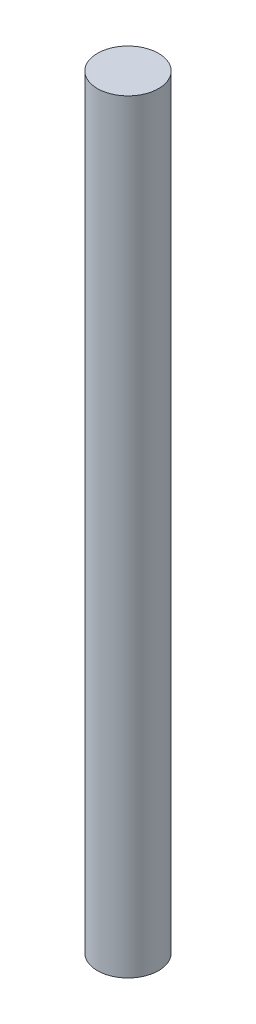
ISO-10303-21;
HEADER;
FILE_DESCRIPTION(('STEP AP214'),'2;1');
FILE_NAME('part.step','',(''),(''),'','','');
FILE_SCHEMA(('AUTOMOTIVE_DESIGN { 1 0 10303 214 1 1 1 1 }'));
ENDSEC;
DATA;
#1=APPLICATION_CONTEXT('core data for automotive mechanical design processes');
#2=APPLICATION_PROTOCOL_DEFINITION('international standard','automotive_design',2000,#1);
#3=PRODUCT_CONTEXT('',#1,'mechanical');
#4=PRODUCT('Part','Part','',(#3));
#5=PRODUCT_RELATED_PRODUCT_CATEGORY('part','',(#4));
#6=PRODUCT_DEFINITION_FORMATION('','',#4);
#7=PRODUCT_DEFINITION_CONTEXT('part definition',#1,'design');
#8=PRODUCT_DEFINITION('design','',#6,#7);
#9=PRODUCT_DEFINITION_SHAPE('','',#8);
#10=(LENGTH_UNIT() NAMED_UNIT(*) SI_UNIT(.MILLI.,.METRE.));
#11=(NAMED_UNIT(*) PLANE_ANGLE_UNIT() SI_UNIT($,.RADIAN.));
#12=(NAMED_UNIT(*) SI_UNIT($,.STERADIAN.) SOLID_ANGLE_UNIT());
#13=UNCERTAINTY_MEASURE_WITH_UNIT(LENGTH_MEASURE(1.E-05),#10,'distance_accuracy_value','');
#14=(GEOMETRIC_REPRESENTATION_CONTEXT(3) GLOBAL_UNCERTAINTY_ASSIGNED_CONTEXT((#13)) GLOBAL_UNIT_ASSIGNED_CONTEXT((#10,
#11,#12)) REPRESENTATION_CONTEXT('',''));
#15=CARTESIAN_POINT('',(0.,0.,0.));
#16=DIRECTION('',(0.,0.,1.));
#17=DIRECTION('',(1.,0.,0.));
#18=AXIS2_PLACEMENT_3D('',#15,#16,#17);
#19=CARTESIAN_POINT('',(0.,750.,0.));
#20=DIRECTION('',(0.,-1.,0.));
#21=DIRECTION('',(0.,0.,-1.));
#22=AXIS2_PLACEMENT_3D('',#19,#20,#21);
#23=CYLINDRICAL_SURFACE('',#22,30.);
#24=CARTESIAN_POINT('',(0.,750.,0.));
#25=DIRECTION('',(0.,1.,0.));
#26=DIRECTION('',(0.,0.,1.));
#27=AXIS2_PLACEMENT_3D('',#24,#25,#26);
#28=CIRCLE('',#27,30.);
#29=CARTESIAN_POINT('',(0.,750.,30.));
#30=VERTEX_POINT('',#29);
#31=EDGE_CURVE('E10',#30,#30,#28,.T.);
#32=ORIENTED_EDGE('',*,*,#31,.F.);
#33=EDGE_LOOP('',(#32));
#34=FACE_BOUND('',#33,.T.);
#35=CARTESIAN_POINT('',(0.,0.,0.));
#36=DIRECTION('',(0.,1.,0.));
#37=DIRECTION('',(0.,0.,1.));
#38=AXIS2_PLACEMENT_3D('',#35,#36,#37);
#39=CIRCLE('',#38,30.);
#40=CARTESIAN_POINT('',(0.,0.,30.));
#41=VERTEX_POINT('',#40);
#42=EDGE_CURVE('E39',#41,#41,#39,.T.);
#43=ORIENTED_EDGE('',*,*,#42,.T.);
#44=EDGE_LOOP('',(#43));
#45=FACE_BOUND('',#44,.T.);
#46=ADVANCED_FACE('F36',(#34,#45),#23,.T.);
#47=CARTESIAN_POINT('',(0.,750.,0.));
#48=DIRECTION('',(0.,1.,0.));
#49=DIRECTION('',(0.,0.,1.));
#50=AXIS2_PLACEMENT_3D('',#47,#48,#49);
#51=PLANE('',#50);
#52=ORIENTED_EDGE('',*,*,#31,.T.);
#53=EDGE_LOOP('',(#52));
#54=FACE_BOUND('',#53,.T.);
#55=ADVANCED_FACE('F51',(#54),#51,.T.);
#56=CARTESIAN_POINT('',(0.,0.,0.));
#57=DIRECTION('',(0.,1.,0.));
#58=DIRECTION('',(0.,0.,1.));
#59=AXIS2_PLACEMENT_3D('',#56,#57,#58);
#60=PLANE('',#59);
#61=ORIENTED_EDGE('',*,*,#42,.F.);
#62=EDGE_LOOP('',(#61));
#63=FACE_BOUND('',#62,.T.);
#64=ADVANCED_FACE('F49',(#63),#60,.F.);
#65=CLOSED_SHELL('',(#46,#55,#64));
#66=MANIFOLD_SOLID_BREP('B2',#65);
#67=ADVANCED_BREP_SHAPE_REPRESENTATION('',(#18,#66),#14);
#68=SHAPE_DEFINITION_REPRESENTATION(#9,#67);
ENDSEC;
END-ISO-10303-21;
